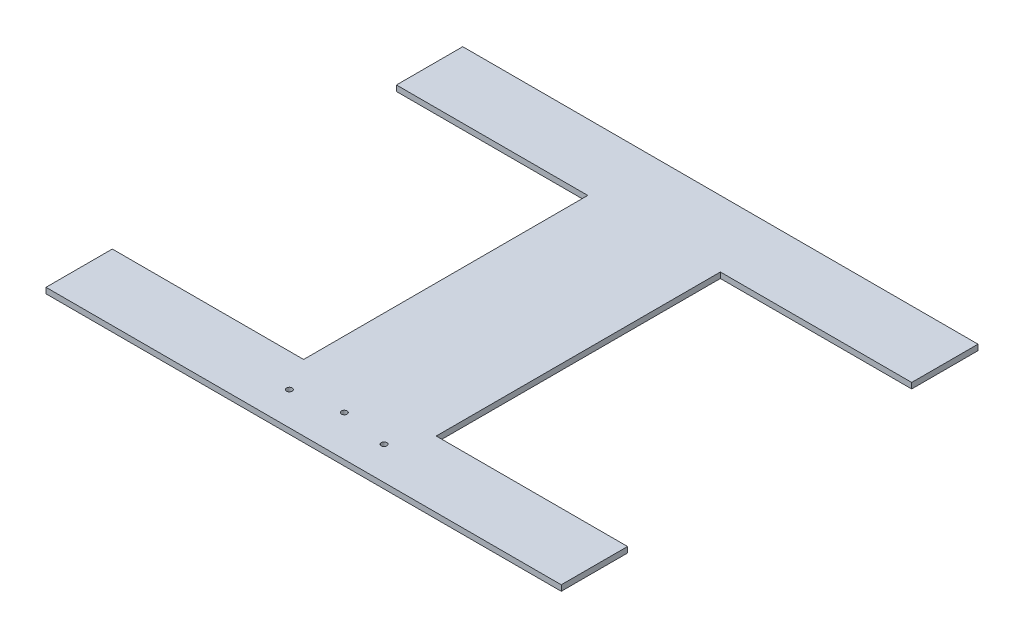
ISO-10303-21;
HEADER;
FILE_DESCRIPTION(('STEP AP214'),'2;1');
FILE_NAME('part.step','',(''),(''),'','','');
FILE_SCHEMA(('AUTOMOTIVE_DESIGN { 1 0 10303 214 1 1 1 1 }'));
ENDSEC;
DATA;
#1=APPLICATION_CONTEXT('core data for automotive mechanical design processes');
#2=APPLICATION_PROTOCOL_DEFINITION('international standard','automotive_design',2000,#1);
#3=PRODUCT_CONTEXT('',#1,'mechanical');
#4=PRODUCT('Part','Part','',(#3));
#5=PRODUCT_RELATED_PRODUCT_CATEGORY('part','',(#4));
#6=PRODUCT_DEFINITION_FORMATION('','',#4);
#7=PRODUCT_DEFINITION_CONTEXT('part definition',#1,'design');
#8=PRODUCT_DEFINITION('design','',#6,#7);
#9=PRODUCT_DEFINITION_SHAPE('','',#8);
#10=(LENGTH_UNIT() NAMED_UNIT(*) SI_UNIT(.MILLI.,.METRE.));
#11=(NAMED_UNIT(*) PLANE_ANGLE_UNIT() SI_UNIT($,.RADIAN.));
#12=(NAMED_UNIT(*) SI_UNIT($,.STERADIAN.) SOLID_ANGLE_UNIT());
#13=UNCERTAINTY_MEASURE_WITH_UNIT(LENGTH_MEASURE(1.E-05),#10,'distance_accuracy_value','');
#14=(GEOMETRIC_REPRESENTATION_CONTEXT(3) GLOBAL_UNCERTAINTY_ASSIGNED_CONTEXT((#13)) GLOBAL_UNIT_ASSIGNED_CONTEXT((#10,
#11,#12)) REPRESENTATION_CONTEXT('',''));
#15=CARTESIAN_POINT('',(0.,0.,0.));
#16=DIRECTION('',(0.,0.,1.));
#17=DIRECTION('',(1.,0.,0.));
#18=AXIS2_PLACEMENT_3D('',#15,#16,#17);
#19=CARTESIAN_POINT('',(-136.,3.,-110.));
#20=DIRECTION('',(1.,0.,0.));
#21=DIRECTION('',(0.,0.,-1.));
#22=AXIS2_PLACEMENT_3D('',#19,#20,#21);
#23=PLANE('',#22);
#24=DIRECTION('',(0.,1.,0.));
#25=VECTOR('',#24,1.);
#26=CARTESIAN_POINT('',(-136.,0.,75.));
#27=LINE('',#26,#25);
#28=CARTESIAN_POINT('',(-136.,0.,75.));
#29=VERTEX_POINT('',#28);
#30=CARTESIAN_POINT('',(-136.,3.,75.));
#31=VERTEX_POINT('',#30);
#32=EDGE_CURVE('E136',#29,#31,#27,.T.);
#33=ORIENTED_EDGE('',*,*,#32,.F.);
#34=DIRECTION('',(0.,0.,1.));
#35=VECTOR('',#34,1.);
#36=CARTESIAN_POINT('',(-136.,0.,-110.));
#37=LINE('',#36,#35);
#38=CARTESIAN_POINT('',(-136.,0.,110.));
#39=VERTEX_POINT('',#38);
#40=EDGE_CURVE('E149',#29,#39,#37,.T.);
#41=ORIENTED_EDGE('',*,*,#40,.T.);
#42=DIRECTION('',(0.,-1.,0.));
#43=VECTOR('',#42,1.);
#44=CARTESIAN_POINT('',(-136.,3.,110.));
#45=LINE('',#44,#43);
#46=CARTESIAN_POINT('',(-136.,3.,110.));
#47=VERTEX_POINT('',#46);
#48=EDGE_CURVE('E12',#47,#39,#45,.T.);
#49=ORIENTED_EDGE('',*,*,#48,.F.);
#50=DIRECTION('',(0.,0.,1.));
#51=VECTOR('',#50,1.);
#52=CARTESIAN_POINT('',(-136.,3.,-110.));
#53=LINE('',#52,#51);
#54=EDGE_CURVE('E190',#31,#47,#53,.T.);
#55=ORIENTED_EDGE('',*,*,#54,.F.);
#56=EDGE_LOOP('',(#33,#41,#49,#55));
#57=FACE_BOUND('',#56,.T.);
#58=ADVANCED_FACE('F36',(#57),#23,.F.);
#59=DIRECTION('',(0.,1.,0.));
#60=VECTOR('',#59,1.);
#61=CARTESIAN_POINT('',(-136.,0.,-75.));
#62=LINE('',#61,#60);
#63=CARTESIAN_POINT('',(-136.,0.,-75.));
#64=VERTEX_POINT('',#63);
#65=CARTESIAN_POINT('',(-136.,3.,-75.));
#66=VERTEX_POINT('',#65);
#67=EDGE_CURVE('E58',#64,#66,#62,.T.);
#68=ORIENTED_EDGE('',*,*,#67,.T.);
#69=CARTESIAN_POINT('',(-136.,3.,-110.));
#70=VERTEX_POINT('',#69);
#71=EDGE_CURVE('E186',#70,#66,#53,.T.);
#72=ORIENTED_EDGE('',*,*,#71,.F.);
#73=DIRECTION('',(0.,-1.,0.));
#74=VECTOR('',#73,1.);
#75=CARTESIAN_POINT('',(-136.,3.,-110.));
#76=LINE('',#75,#74);
#77=CARTESIAN_POINT('',(-136.,0.,-110.));
#78=VERTEX_POINT('',#77);
#79=EDGE_CURVE('E198',#70,#78,#76,.T.);
#80=ORIENTED_EDGE('',*,*,#79,.T.);
#81=EDGE_CURVE('E199',#78,#64,#37,.T.);
#82=ORIENTED_EDGE('',*,*,#81,.T.);
#83=EDGE_LOOP('',(#68,#72,#80,#82));
#84=FACE_BOUND('',#83,.T.);
#85=ADVANCED_FACE('F238',(#84),#23,.F.);
#86=CARTESIAN_POINT('',(136.,3.,-110.));
#87=DIRECTION('',(-1.,0.,0.));
#88=DIRECTION('',(0.,0.,1.));
#89=AXIS2_PLACEMENT_3D('',#86,#87,#88);
#90=PLANE('',#89);
#91=DIRECTION('',(0.,1.,0.));
#92=VECTOR('',#91,1.);
#93=CARTESIAN_POINT('',(136.,0.,-75.));
#94=LINE('',#93,#92);
#95=CARTESIAN_POINT('',(136.,0.,-75.));
#96=VERTEX_POINT('',#95);
#97=CARTESIAN_POINT('',(136.,3.,-75.));
#98=VERTEX_POINT('',#97);
#99=EDGE_CURVE('E176',#96,#98,#94,.T.);
#100=ORIENTED_EDGE('',*,*,#99,.F.);
#101=DIRECTION('',(0.,0.,-1.));
#102=VECTOR('',#101,1.);
#103=CARTESIAN_POINT('',(136.,0.,-110.));
#104=LINE('',#103,#102);
#105=CARTESIAN_POINT('',(136.,0.,-110.));
#106=VERTEX_POINT('',#105);
#107=EDGE_CURVE('E204',#96,#106,#104,.T.);
#108=ORIENTED_EDGE('',*,*,#107,.T.);
#109=DIRECTION('',(0.,-1.,0.));
#110=VECTOR('',#109,1.);
#111=CARTESIAN_POINT('',(136.,3.,-110.));
#112=LINE('',#111,#110);
#113=CARTESIAN_POINT('',(136.,3.,-110.));
#114=VERTEX_POINT('',#113);
#115=EDGE_CURVE('E212',#114,#106,#112,.T.);
#116=ORIENTED_EDGE('',*,*,#115,.F.);
#117=DIRECTION('',(0.,0.,-1.));
#118=VECTOR('',#117,1.);
#119=CARTESIAN_POINT('',(136.,3.,-110.));
#120=LINE('',#119,#118);
#121=EDGE_CURVE('E192',#98,#114,#120,.T.);
#122=ORIENTED_EDGE('',*,*,#121,.F.);
#123=EDGE_LOOP('',(#100,#108,#116,#122));
#124=FACE_BOUND('',#123,.T.);
#125=ADVANCED_FACE('F294',(#124),#90,.F.);
#126=DIRECTION('',(0.,1.,0.));
#127=VECTOR('',#126,1.);
#128=CARTESIAN_POINT('',(136.,0.,75.));
#129=LINE('',#128,#127);
#130=CARTESIAN_POINT('',(136.,0.,75.));
#131=VERTEX_POINT('',#130);
#132=CARTESIAN_POINT('',(136.,3.,75.));
#133=VERTEX_POINT('',#132);
#134=EDGE_CURVE('E50',#131,#133,#129,.T.);
#135=ORIENTED_EDGE('',*,*,#134,.T.);
#136=CARTESIAN_POINT('',(136.,3.,110.));
#137=VERTEX_POINT('',#136);
#138=EDGE_CURVE('E193',#137,#133,#120,.T.);
#139=ORIENTED_EDGE('',*,*,#138,.F.);
#140=DIRECTION('',(0.,-1.,0.));
#141=VECTOR('',#140,1.);
#142=CARTESIAN_POINT('',(136.,3.,110.));
#143=LINE('',#142,#141);
#144=CARTESIAN_POINT('',(136.,0.,110.));
#145=VERTEX_POINT('',#144);
#146=EDGE_CURVE('E43',#137,#145,#143,.T.);
#147=ORIENTED_EDGE('',*,*,#146,.T.);
#148=EDGE_CURVE('E205',#145,#131,#104,.T.);
#149=ORIENTED_EDGE('',*,*,#148,.T.);
#150=EDGE_LOOP('',(#135,#139,#147,#149));
#151=FACE_BOUND('',#150,.T.);
#152=ADVANCED_FACE('F219',(#151),#90,.F.);
#153=CARTESIAN_POINT('',(0.,3.,0.));
#154=DIRECTION('',(0.,-1.,0.));
#155=DIRECTION('',(0.,0.,-1.));
#156=AXIS2_PLACEMENT_3D('',#153,#154,#155);
#157=PLANE('',#156);
#158=CARTESIAN_POINT('',(-5.45703242963428E-13,3.,88.5000000000014));
#159=DIRECTION('',(0.,-1.,0.));
#160=DIRECTION('',(0.,0.,-1.));
#161=AXIS2_PLACEMENT_3D('',#158,#159,#160);
#162=CIRCLE('',#161,1.50000000000063);
#163=CARTESIAN_POINT('',(-5.45703242963428E-13,3.,87.0000000000007));
#164=VERTEX_POINT('',#163);
#165=EDGE_CURVE('E247',#164,#164,#162,.T.);
#166=ORIENTED_EDGE('',*,*,#165,.T.);
#167=EDGE_LOOP('',(#166));
#168=FACE_BOUND('',#167,.T.);
#169=CARTESIAN_POINT('',(24.9999999999998,3.,92.5000000000023));
#170=DIRECTION('',(0.,-1.,0.));
#171=DIRECTION('',(0.,0.,-1.));
#172=AXIS2_PLACEMENT_3D('',#169,#170,#171);
#173=CIRCLE('',#172,1.5);
#174=CARTESIAN_POINT('',(24.9999999999998,3.,91.0000000000023));
#175=VERTEX_POINT('',#174);
#176=EDGE_CURVE('E164',#175,#175,#173,.T.);
#177=ORIENTED_EDGE('',*,*,#176,.T.);
#178=EDGE_LOOP('',(#177));
#179=FACE_BOUND('',#178,.T.);
#180=CARTESIAN_POINT('',(-25.0000000000002,3.,92.5000000000023));
#181=DIRECTION('',(0.,-1.,0.));
#182=DIRECTION('',(0.,0.,-1.));
#183=AXIS2_PLACEMENT_3D('',#180,#181,#182);
#184=CIRCLE('',#183,1.5);
#185=CARTESIAN_POINT('',(-25.0000000000002,3.,91.0000000000023));
#186=VERTEX_POINT('',#185);
#187=EDGE_CURVE('E246',#186,#186,#184,.T.);
#188=ORIENTED_EDGE('',*,*,#187,.T.);
#189=EDGE_LOOP('',(#188));
#190=FACE_BOUND('',#189,.T.);
#191=DIRECTION('',(1.,0.,0.));
#192=VECTOR('',#191,1.);
#193=CARTESIAN_POINT('',(136.,3.,-75.));
#194=LINE('',#193,#192);
#195=CARTESIAN_POINT('',(35.0000000000001,3.,-75.));
#196=VERTEX_POINT('',#195);
#197=EDGE_CURVE('E173',#196,#98,#194,.T.);
#198=ORIENTED_EDGE('',*,*,#197,.T.);
#199=ORIENTED_EDGE('',*,*,#121,.T.);
#200=DIRECTION('',(-1.,0.,0.));
#201=VECTOR('',#200,1.);
#202=CARTESIAN_POINT('',(136.,3.,-110.));
#203=LINE('',#202,#201);
#204=EDGE_CURVE('E196',#114,#70,#203,.T.);
#205=ORIENTED_EDGE('',*,*,#204,.T.);
#206=ORIENTED_EDGE('',*,*,#71,.T.);
#207=DIRECTION('',(1.,0.,0.));
#208=VECTOR('',#207,1.);
#209=CARTESIAN_POINT('',(-136.,3.,-75.));
#210=LINE('',#209,#208);
#211=CARTESIAN_POINT('',(-35.,3.,-75.));
#212=VERTEX_POINT('',#211);
#213=EDGE_CURVE('E160',#66,#212,#210,.T.);
#214=ORIENTED_EDGE('',*,*,#213,.T.);
#215=DIRECTION('',(0.,0.,1.));
#216=VECTOR('',#215,1.);
#217=CARTESIAN_POINT('',(-35.,3.,-75.));
#218=LINE('',#217,#216);
#219=CARTESIAN_POINT('',(-35.,3.,75.));
#220=VERTEX_POINT('',#219);
#221=EDGE_CURVE('E163',#212,#220,#218,.T.);
#222=ORIENTED_EDGE('',*,*,#221,.T.);
#223=DIRECTION('',(-1.,0.,0.));
#224=VECTOR('',#223,1.);
#225=CARTESIAN_POINT('',(-136.,3.,75.));
#226=LINE('',#225,#224);
#227=EDGE_CURVE('E132',#220,#31,#226,.T.);
#228=ORIENTED_EDGE('',*,*,#227,.T.);
#229=ORIENTED_EDGE('',*,*,#54,.T.);
#230=DIRECTION('',(1.,0.,0.));
#231=VECTOR('',#230,1.);
#232=CARTESIAN_POINT('',(136.,3.,110.));
#233=LINE('',#232,#231);
#234=EDGE_CURVE('E189',#47,#137,#233,.T.);
#235=ORIENTED_EDGE('',*,*,#234,.T.);
#236=ORIENTED_EDGE('',*,*,#138,.T.);
#237=DIRECTION('',(-1.,0.,0.));
#238=VECTOR('',#237,1.);
#239=CARTESIAN_POINT('',(136.,3.,75.));
#240=LINE('',#239,#238);
#241=CARTESIAN_POINT('',(35.0000000000001,3.,75.));
#242=VERTEX_POINT('',#241);
#243=EDGE_CURVE('E167',#133,#242,#240,.T.);
#244=ORIENTED_EDGE('',*,*,#243,.T.);
#245=DIRECTION('',(0.,0.,-1.));
#246=VECTOR('',#245,1.);
#247=CARTESIAN_POINT('',(35.0000000000001,3.,-75.));
#248=LINE('',#247,#246);
#249=EDGE_CURVE('E170',#242,#196,#248,.T.);
#250=ORIENTED_EDGE('',*,*,#249,.T.);
#251=EDGE_LOOP('',(#198,#199,#205,#206,#214,#222,#228,#229,#235,#236,#244,#250));
#252=FACE_BOUND('',#251,.T.);
#253=ADVANCED_FACE('F230',(#168,#179,#190,#252),#157,.F.);
#254=CARTESIAN_POINT('',(0.,0.,0.));
#255=DIRECTION('',(0.,-1.,0.));
#256=DIRECTION('',(0.,0.,-1.));
#257=AXIS2_PLACEMENT_3D('',#254,#255,#256);
#258=PLANE('',#257);
#259=CARTESIAN_POINT('',(-5.45703242963428E-13,0.,88.5000000000014));
#260=DIRECTION('',(0.,-1.,0.));
#261=DIRECTION('',(0.,0.,-1.));
#262=AXIS2_PLACEMENT_3D('',#259,#260,#261);
#263=CIRCLE('',#262,1.50000000000063);
#264=CARTESIAN_POINT('',(-5.45703242963428E-13,0.,87.0000000000007));
#265=VERTEX_POINT('',#264);
#266=EDGE_CURVE('E255',#265,#265,#263,.T.);
#267=ORIENTED_EDGE('',*,*,#266,.F.);
#268=EDGE_LOOP('',(#267));
#269=FACE_BOUND('',#268,.T.);
#270=CARTESIAN_POINT('',(24.9999999999998,0.,92.5000000000023));
#271=DIRECTION('',(0.,-1.,0.));
#272=DIRECTION('',(0.,0.,-1.));
#273=AXIS2_PLACEMENT_3D('',#270,#271,#272);
#274=CIRCLE('',#273,1.5);
#275=CARTESIAN_POINT('',(24.9999999999998,0.,91.0000000000023));
#276=VERTEX_POINT('',#275);
#277=EDGE_CURVE('E250',#276,#276,#274,.T.);
#278=ORIENTED_EDGE('',*,*,#277,.F.);
#279=EDGE_LOOP('',(#278));
#280=FACE_BOUND('',#279,.T.);
#281=CARTESIAN_POINT('',(-25.0000000000002,0.,92.5000000000023));
#282=DIRECTION('',(0.,-1.,0.));
#283=DIRECTION('',(0.,0.,-1.));
#284=AXIS2_PLACEMENT_3D('',#281,#282,#283);
#285=CIRCLE('',#284,1.5);
#286=CARTESIAN_POINT('',(-25.0000000000002,0.,91.0000000000023));
#287=VERTEX_POINT('',#286);
#288=EDGE_CURVE('E243',#287,#287,#285,.T.);
#289=ORIENTED_EDGE('',*,*,#288,.F.);
#290=EDGE_LOOP('',(#289));
#291=FACE_BOUND('',#290,.T.);
#292=ORIENTED_EDGE('',*,*,#107,.F.);
#293=DIRECTION('',(1.,0.,0.));
#294=VECTOR('',#293,1.);
#295=CARTESIAN_POINT('',(136.,0.,-75.));
#296=LINE('',#295,#294);
#297=CARTESIAN_POINT('',(35.0000000000001,0.,-75.));
#298=VERTEX_POINT('',#297);
#299=EDGE_CURVE('E158',#298,#96,#296,.T.);
#300=ORIENTED_EDGE('',*,*,#299,.F.);
#301=DIRECTION('',(0.,0.,-1.));
#302=VECTOR('',#301,1.);
#303=CARTESIAN_POINT('',(35.0000000000001,0.,-75.));
#304=LINE('',#303,#302);
#305=CARTESIAN_POINT('',(35.0000000000001,0.,75.));
#306=VERTEX_POINT('',#305);
#307=EDGE_CURVE('E152',#306,#298,#304,.T.);
#308=ORIENTED_EDGE('',*,*,#307,.F.);
#309=DIRECTION('',(-1.,0.,0.));
#310=VECTOR('',#309,1.);
#311=CARTESIAN_POINT('',(136.,0.,75.));
#312=LINE('',#311,#310);
#313=EDGE_CURVE('E150',#131,#306,#312,.T.);
#314=ORIENTED_EDGE('',*,*,#313,.F.);
#315=ORIENTED_EDGE('',*,*,#148,.F.);
#316=DIRECTION('',(1.,0.,0.));
#317=VECTOR('',#316,1.);
#318=CARTESIAN_POINT('',(136.,0.,110.));
#319=LINE('',#318,#317);
#320=EDGE_CURVE('E202',#39,#145,#319,.T.);
#321=ORIENTED_EDGE('',*,*,#320,.F.);
#322=ORIENTED_EDGE('',*,*,#40,.F.);
#323=DIRECTION('',(-1.,0.,0.));
#324=VECTOR('',#323,1.);
#325=CARTESIAN_POINT('',(-136.,0.,75.));
#326=LINE('',#325,#324);
#327=CARTESIAN_POINT('',(-35.,0.,75.));
#328=VERTEX_POINT('',#327);
#329=EDGE_CURVE('E129',#328,#29,#326,.T.);
#330=ORIENTED_EDGE('',*,*,#329,.F.);
#331=DIRECTION('',(0.,0.,1.));
#332=VECTOR('',#331,1.);
#333=CARTESIAN_POINT('',(-35.,0.,-75.));
#334=LINE('',#333,#332);
#335=CARTESIAN_POINT('',(-35.,0.,-75.));
#336=VERTEX_POINT('',#335);
#337=EDGE_CURVE('E140',#336,#328,#334,.T.);
#338=ORIENTED_EDGE('',*,*,#337,.F.);
#339=DIRECTION('',(1.,0.,0.));
#340=VECTOR('',#339,1.);
#341=CARTESIAN_POINT('',(-136.,0.,-75.));
#342=LINE('',#341,#340);
#343=EDGE_CURVE('E143',#64,#336,#342,.T.);
#344=ORIENTED_EDGE('',*,*,#343,.F.);
#345=ORIENTED_EDGE('',*,*,#81,.F.);
#346=DIRECTION('',(-1.,0.,0.));
#347=VECTOR('',#346,1.);
#348=CARTESIAN_POINT('',(136.,0.,-110.));
#349=LINE('',#348,#347);
#350=EDGE_CURVE('E208',#106,#78,#349,.T.);
#351=ORIENTED_EDGE('',*,*,#350,.F.);
#352=EDGE_LOOP('',(#292,#300,#308,#314,#315,#321,#322,#330,#338,#344,#345,#351));
#353=FACE_BOUND('',#352,.T.);
#354=ADVANCED_FACE('F147',(#269,#280,#291,#353),#258,.T.);
#355=CARTESIAN_POINT('',(136.,3.,110.));
#356=DIRECTION('',(0.,0.,-1.));
#357=DIRECTION('',(-1.,0.,0.));
#358=AXIS2_PLACEMENT_3D('',#355,#356,#357);
#359=PLANE('',#358);
#360=ORIENTED_EDGE('',*,*,#320,.T.);
#361=ORIENTED_EDGE('',*,*,#146,.F.);
#362=ORIENTED_EDGE('',*,*,#234,.F.);
#363=ORIENTED_EDGE('',*,*,#48,.T.);
#364=EDGE_LOOP('',(#360,#361,#362,#363));
#365=FACE_BOUND('',#364,.T.);
#366=ADVANCED_FACE('F233',(#365),#359,.F.);
#367=CARTESIAN_POINT('',(136.,3.,-110.));
#368=DIRECTION('',(0.,0.,1.));
#369=DIRECTION('',(1.,0.,0.));
#370=AXIS2_PLACEMENT_3D('',#367,#368,#369);
#371=PLANE('',#370);
#372=ORIENTED_EDGE('',*,*,#350,.T.);
#373=ORIENTED_EDGE('',*,*,#79,.F.);
#374=ORIENTED_EDGE('',*,*,#204,.F.);
#375=ORIENTED_EDGE('',*,*,#115,.T.);
#376=EDGE_LOOP('',(#372,#373,#374,#375));
#377=FACE_BOUND('',#376,.T.);
#378=ADVANCED_FACE('F305',(#377),#371,.F.);
#379=CARTESIAN_POINT('',(-136.,0.,-75.));
#380=DIRECTION('',(0.,0.,1.));
#381=DIRECTION('',(1.,0.,0.));
#382=AXIS2_PLACEMENT_3D('',#379,#380,#381);
#383=PLANE('',#382);
#384=ORIENTED_EDGE('',*,*,#213,.F.);
#385=ORIENTED_EDGE('',*,*,#67,.F.);
#386=ORIENTED_EDGE('',*,*,#343,.T.);
#387=DIRECTION('',(0.,1.,0.));
#388=VECTOR('',#387,1.);
#389=CARTESIAN_POINT('',(-35.,0.,-75.));
#390=LINE('',#389,#388);
#391=EDGE_CURVE('E137',#336,#212,#390,.T.);
#392=ORIENTED_EDGE('',*,*,#391,.T.);
#393=EDGE_LOOP('',(#384,#385,#386,#392));
#394=FACE_BOUND('',#393,.T.);
#395=ADVANCED_FACE('F236',(#394),#383,.T.);
#396=CARTESIAN_POINT('',(-35.,0.,-75.));
#397=DIRECTION('',(-1.,0.,0.));
#398=DIRECTION('',(0.,0.,1.));
#399=AXIS2_PLACEMENT_3D('',#396,#397,#398);
#400=PLANE('',#399);
#401=ORIENTED_EDGE('',*,*,#221,.F.);
#402=ORIENTED_EDGE('',*,*,#391,.F.);
#403=ORIENTED_EDGE('',*,*,#337,.T.);
#404=DIRECTION('',(0.,1.,0.));
#405=VECTOR('',#404,1.);
#406=CARTESIAN_POINT('',(-35.,0.,75.));
#407=LINE('',#406,#405);
#408=EDGE_CURVE('E125',#328,#220,#407,.T.);
#409=ORIENTED_EDGE('',*,*,#408,.T.);
#410=EDGE_LOOP('',(#401,#402,#403,#409));
#411=FACE_BOUND('',#410,.T.);
#412=ADVANCED_FACE('F141',(#411),#400,.T.);
#413=CARTESIAN_POINT('',(-136.,0.,75.));
#414=DIRECTION('',(0.,0.,-1.));
#415=DIRECTION('',(-1.,0.,0.));
#416=AXIS2_PLACEMENT_3D('',#413,#414,#415);
#417=PLANE('',#416);
#418=ORIENTED_EDGE('',*,*,#227,.F.);
#419=ORIENTED_EDGE('',*,*,#408,.F.);
#420=ORIENTED_EDGE('',*,*,#329,.T.);
#421=ORIENTED_EDGE('',*,*,#32,.T.);
#422=EDGE_LOOP('',(#418,#419,#420,#421));
#423=FACE_BOUND('',#422,.T.);
#424=ADVANCED_FACE('F127',(#423),#417,.T.);
#425=CARTESIAN_POINT('',(136.,0.,-75.));
#426=DIRECTION('',(0.,0.,1.));
#427=DIRECTION('',(1.,0.,0.));
#428=AXIS2_PLACEMENT_3D('',#425,#426,#427);
#429=PLANE('',#428);
#430=ORIENTED_EDGE('',*,*,#197,.F.);
#431=DIRECTION('',(0.,1.,0.));
#432=VECTOR('',#431,1.);
#433=CARTESIAN_POINT('',(35.0000000000001,0.,-75.));
#434=LINE('',#433,#432);
#435=EDGE_CURVE('E178',#298,#196,#434,.T.);
#436=ORIENTED_EDGE('',*,*,#435,.F.);
#437=ORIENTED_EDGE('',*,*,#299,.T.);
#438=ORIENTED_EDGE('',*,*,#99,.T.);
#439=EDGE_LOOP('',(#430,#436,#437,#438));
#440=FACE_BOUND('',#439,.T.);
#441=ADVANCED_FACE('F319',(#440),#429,.T.);
#442=CARTESIAN_POINT('',(35.0000000000001,0.,-75.));
#443=DIRECTION('',(1.,0.,0.));
#444=DIRECTION('',(0.,0.,-1.));
#445=AXIS2_PLACEMENT_3D('',#442,#443,#444);
#446=PLANE('',#445);
#447=ORIENTED_EDGE('',*,*,#249,.F.);
#448=DIRECTION('',(0.,1.,0.));
#449=VECTOR('',#448,1.);
#450=CARTESIAN_POINT('',(35.0000000000001,0.,75.));
#451=LINE('',#450,#449);
#452=EDGE_CURVE('E180',#306,#242,#451,.T.);
#453=ORIENTED_EDGE('',*,*,#452,.F.);
#454=ORIENTED_EDGE('',*,*,#307,.T.);
#455=ORIENTED_EDGE('',*,*,#435,.T.);
#456=EDGE_LOOP('',(#447,#453,#454,#455));
#457=FACE_BOUND('',#456,.T.);
#458=ADVANCED_FACE('F227',(#457),#446,.T.);
#459=CARTESIAN_POINT('',(136.,0.,75.));
#460=DIRECTION('',(0.,0.,-1.));
#461=DIRECTION('',(-1.,0.,0.));
#462=AXIS2_PLACEMENT_3D('',#459,#460,#461);
#463=PLANE('',#462);
#464=ORIENTED_EDGE('',*,*,#243,.F.);
#465=ORIENTED_EDGE('',*,*,#134,.F.);
#466=ORIENTED_EDGE('',*,*,#313,.T.);
#467=ORIENTED_EDGE('',*,*,#452,.T.);
#468=EDGE_LOOP('',(#464,#465,#466,#467));
#469=FACE_BOUND('',#468,.T.);
#470=ADVANCED_FACE('F224',(#469),#463,.T.);
#471=CARTESIAN_POINT('',(-25.0000000000002,3.,92.5000000000023));
#472=DIRECTION('',(0.,-1.,0.));
#473=DIRECTION('',(0.,0.,-1.));
#474=AXIS2_PLACEMENT_3D('',#471,#472,#473);
#475=CYLINDRICAL_SURFACE('',#474,1.5);
#476=ORIENTED_EDGE('',*,*,#187,.F.);
#477=EDGE_LOOP('',(#476));
#478=FACE_BOUND('',#477,.T.);
#479=ORIENTED_EDGE('',*,*,#288,.T.);
#480=EDGE_LOOP('',(#479));
#481=FACE_BOUND('',#480,.T.);
#482=ADVANCED_FACE('F277',(#478,#481),#475,.F.);
#483=CARTESIAN_POINT('',(24.9999999999998,3.,92.5000000000023));
#484=DIRECTION('',(0.,-1.,0.));
#485=DIRECTION('',(0.,0.,-1.));
#486=AXIS2_PLACEMENT_3D('',#483,#484,#485);
#487=CYLINDRICAL_SURFACE('',#486,1.5);
#488=ORIENTED_EDGE('',*,*,#176,.F.);
#489=EDGE_LOOP('',(#488));
#490=FACE_BOUND('',#489,.T.);
#491=ORIENTED_EDGE('',*,*,#277,.T.);
#492=EDGE_LOOP('',(#491));
#493=FACE_BOUND('',#492,.T.);
#494=ADVANCED_FACE('F266',(#490,#493),#487,.F.);
#495=CARTESIAN_POINT('',(-5.45703242963428E-13,3.,88.5000000000014));
#496=DIRECTION('',(0.,-1.,0.));
#497=DIRECTION('',(0.,0.,-1.));
#498=AXIS2_PLACEMENT_3D('',#495,#496,#497);
#499=CYLINDRICAL_SURFACE('',#498,1.50000000000063);
#500=ORIENTED_EDGE('',*,*,#165,.F.);
#501=EDGE_LOOP('',(#500));
#502=FACE_BOUND('',#501,.T.);
#503=ORIENTED_EDGE('',*,*,#266,.T.);
#504=EDGE_LOOP('',(#503));
#505=FACE_BOUND('',#504,.T.);
#506=ADVANCED_FACE('F263',(#502,#505),#499,.F.);
#507=CLOSED_SHELL('',(#58,#85,#125,#152,#253,#354,#366,#378,#395,#412,#424,#441,#458,#470,#482,
#494,#506));
#508=MANIFOLD_SOLID_BREP('B2',#507);
#509=ADVANCED_BREP_SHAPE_REPRESENTATION('',(#18,#508),#14);
#510=SHAPE_DEFINITION_REPRESENTATION(#9,#509);
ENDSEC;
END-ISO-10303-21;
